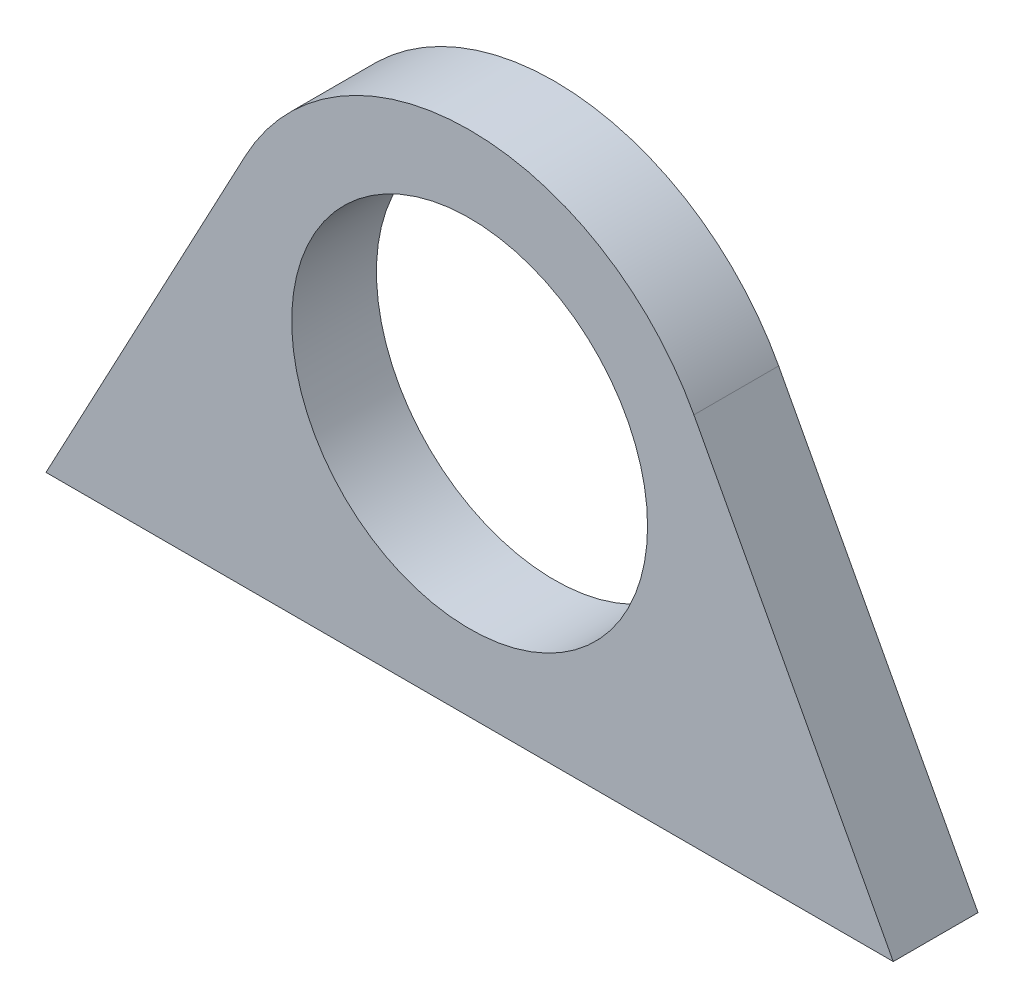
ISO-10303-21;
HEADER;
FILE_DESCRIPTION(('STEP AP214'),'2;1');
FILE_NAME('part.step','',(''),(''),'','','');
FILE_SCHEMA(('AUTOMOTIVE_DESIGN { 1 0 10303 214 1 1 1 1 }'));
ENDSEC;
DATA;
#1=APPLICATION_CONTEXT('core data for automotive mechanical design processes');
#2=APPLICATION_PROTOCOL_DEFINITION('international standard','automotive_design',2000,#1);
#3=PRODUCT_CONTEXT('',#1,'mechanical');
#4=PRODUCT('Part','Part','',(#3));
#5=PRODUCT_RELATED_PRODUCT_CATEGORY('part','',(#4));
#6=PRODUCT_DEFINITION_FORMATION('','',#4);
#7=PRODUCT_DEFINITION_CONTEXT('part definition',#1,'design');
#8=PRODUCT_DEFINITION('design','',#6,#7);
#9=PRODUCT_DEFINITION_SHAPE('','',#8);
#10=(LENGTH_UNIT() NAMED_UNIT(*) SI_UNIT(.MILLI.,.METRE.));
#11=(NAMED_UNIT(*) PLANE_ANGLE_UNIT() SI_UNIT($,.RADIAN.));
#12=(NAMED_UNIT(*) SI_UNIT($,.STERADIAN.) SOLID_ANGLE_UNIT());
#13=UNCERTAINTY_MEASURE_WITH_UNIT(LENGTH_MEASURE(1.E-05),#10,'distance_accuracy_value','');
#14=(GEOMETRIC_REPRESENTATION_CONTEXT(3) GLOBAL_UNCERTAINTY_ASSIGNED_CONTEXT((#13)) GLOBAL_UNIT_ASSIGNED_CONTEXT((#10,
#11,#12)) REPRESENTATION_CONTEXT('',''));
#15=CARTESIAN_POINT('',(0.,0.,0.));
#16=DIRECTION('',(0.,0.,1.));
#17=DIRECTION('',(1.,0.,0.));
#18=AXIS2_PLACEMENT_3D('',#15,#16,#17);
#19=CARTESIAN_POINT('',(0.,0.,5.));
#20=DIRECTION('',(0.,0.,1.));
#21=DIRECTION('',(1.,0.,0.));
#22=AXIS2_PLACEMENT_3D('',#19,#20,#21);
#23=PLANE('',#22);
#24=DIRECTION('',(-0.470588235294118,0.882352941176471,0.));
#25=VECTOR('',#24,1.);
#26=CARTESIAN_POINT('',(25.,-15.,5.));
#27=LINE('',#26,#25);
#28=CARTESIAN_POINT('',(25.,-15.,5.));
#29=VERTEX_POINT('',#28);
#30=CARTESIAN_POINT('',(13.2352941176471,7.05882352941177,5.));
#31=VERTEX_POINT('',#30);
#32=EDGE_CURVE('E92',#29,#31,#27,.T.);
#33=ORIENTED_EDGE('',*,*,#32,.T.);
#34=CARTESIAN_POINT('',(0.,0.,5.));
#35=DIRECTION('',(0.,0.,1.));
#36=DIRECTION('',(1.,0.,0.));
#37=AXIS2_PLACEMENT_3D('',#34,#35,#36);
#38=CIRCLE('',#37,15.);
#39=CARTESIAN_POINT('',(-13.2352941176471,7.05882352941177,5.));
#40=VERTEX_POINT('',#39);
#41=EDGE_CURVE('E87',#31,#40,#38,.T.);
#42=ORIENTED_EDGE('',*,*,#41,.T.);
#43=DIRECTION('',(-0.470588235294118,-0.882352941176471,0.));
#44=VECTOR('',#43,1.);
#45=CARTESIAN_POINT('',(-25.,-15.,5.));
#46=LINE('',#45,#44);
#47=CARTESIAN_POINT('',(-25.,-15.,5.));
#48=VERTEX_POINT('',#47);
#49=EDGE_CURVE('E90',#40,#48,#46,.T.);
#50=ORIENTED_EDGE('',*,*,#49,.T.);
#51=DIRECTION('',(1.,0.,0.));
#52=VECTOR('',#51,1.);
#53=CARTESIAN_POINT('',(-25.,-15.,5.));
#54=LINE('',#53,#52);
#55=EDGE_CURVE('E57',#48,#29,#54,.T.);
#56=ORIENTED_EDGE('',*,*,#55,.T.);
#57=EDGE_LOOP('',(#33,#42,#50,#56));
#58=FACE_BOUND('',#57,.T.);
#59=CARTESIAN_POINT('',(0.,0.,5.));
#60=DIRECTION('',(0.,0.,1.));
#61=DIRECTION('',(1.,0.,0.));
#62=AXIS2_PLACEMENT_3D('',#59,#60,#61);
#63=CIRCLE('',#62,10.5);
#64=CARTESIAN_POINT('',(10.5,0.,5.));
#65=VERTEX_POINT('',#64);
#66=EDGE_CURVE('E112',#65,#65,#63,.T.);
#67=ORIENTED_EDGE('',*,*,#66,.F.);
#68=EDGE_LOOP('',(#67));
#69=FACE_BOUND('',#68,.T.);
#70=ADVANCED_FACE('F39',(#58,#69),#23,.T.);
#71=CARTESIAN_POINT('',(0.,0.,0.));
#72=DIRECTION('',(0.,0.,1.));
#73=DIRECTION('',(1.,0.,0.));
#74=AXIS2_PLACEMENT_3D('',#71,#72,#73);
#75=PLANE('',#74);
#76=DIRECTION('',(-0.470588235294118,0.882352941176471,0.));
#77=VECTOR('',#76,1.);
#78=CARTESIAN_POINT('',(25.,-15.,0.));
#79=LINE('',#78,#77);
#80=CARTESIAN_POINT('',(25.,-15.,0.));
#81=VERTEX_POINT('',#80);
#82=CARTESIAN_POINT('',(13.2352941176471,7.05882352941177,0.));
#83=VERTEX_POINT('',#82);
#84=EDGE_CURVE('E108',#81,#83,#79,.T.);
#85=ORIENTED_EDGE('',*,*,#84,.F.);
#86=DIRECTION('',(1.,0.,0.));
#87=VECTOR('',#86,1.);
#88=CARTESIAN_POINT('',(-25.,-15.,0.));
#89=LINE('',#88,#87);
#90=CARTESIAN_POINT('',(-25.,-15.,0.));
#91=VERTEX_POINT('',#90);
#92=EDGE_CURVE('E80',#91,#81,#89,.T.);
#93=ORIENTED_EDGE('',*,*,#92,.F.);
#94=DIRECTION('',(-0.470588235294118,-0.882352941176471,0.));
#95=VECTOR('',#94,1.);
#96=CARTESIAN_POINT('',(-25.,-15.,0.));
#97=LINE('',#96,#95);
#98=CARTESIAN_POINT('',(-13.2352941176471,7.05882352941177,0.));
#99=VERTEX_POINT('',#98);
#100=EDGE_CURVE('E74',#99,#91,#97,.T.);
#101=ORIENTED_EDGE('',*,*,#100,.F.);
#102=CARTESIAN_POINT('',(0.,0.,0.));
#103=DIRECTION('',(0.,0.,1.));
#104=DIRECTION('',(1.,0.,0.));
#105=AXIS2_PLACEMENT_3D('',#102,#103,#104);
#106=CIRCLE('',#105,15.);
#107=EDGE_CURVE('E97',#83,#99,#106,.T.);
#108=ORIENTED_EDGE('',*,*,#107,.F.);
#109=EDGE_LOOP('',(#85,#93,#101,#108));
#110=FACE_BOUND('',#109,.T.);
#111=CARTESIAN_POINT('',(0.,0.,0.));
#112=DIRECTION('',(0.,0.,1.));
#113=DIRECTION('',(1.,0.,0.));
#114=AXIS2_PLACEMENT_3D('',#111,#112,#113);
#115=CIRCLE('',#114,10.5);
#116=CARTESIAN_POINT('',(10.5,0.,0.));
#117=VERTEX_POINT('',#116);
#118=EDGE_CURVE('E130',#117,#117,#115,.T.);
#119=ORIENTED_EDGE('',*,*,#118,.T.);
#120=EDGE_LOOP('',(#119));
#121=FACE_BOUND('',#120,.T.);
#122=ADVANCED_FACE('F125',(#110,#121),#75,.F.);
#123=CARTESIAN_POINT('',(25.,-15.,5.));
#124=DIRECTION('',(-0.882352941176471,-0.470588235294118,0.));
#125=DIRECTION('',(0.470588235294118,-0.882352941176471,0.));
#126=AXIS2_PLACEMENT_3D('',#123,#124,#125);
#127=PLANE('',#126);
#128=ORIENTED_EDGE('',*,*,#84,.T.);
#129=DIRECTION('',(0.,0.,-1.));
#130=VECTOR('',#129,1.);
#131=CARTESIAN_POINT('',(13.2352941176471,7.05882352941177,5.));
#132=LINE('',#131,#130);
#133=EDGE_CURVE('E11',#31,#83,#132,.T.);
#134=ORIENTED_EDGE('',*,*,#133,.F.);
#135=ORIENTED_EDGE('',*,*,#32,.F.);
#136=DIRECTION('',(0.,0.,-1.));
#137=VECTOR('',#136,1.);
#138=CARTESIAN_POINT('',(25.,-15.,5.));
#139=LINE('',#138,#137);
#140=EDGE_CURVE('E104',#29,#81,#139,.T.);
#141=ORIENTED_EDGE('',*,*,#140,.T.);
#142=EDGE_LOOP('',(#128,#134,#135,#141));
#143=FACE_BOUND('',#142,.T.);
#144=ADVANCED_FACE('F41',(#143),#127,.F.);
#145=CARTESIAN_POINT('',(0.,0.,5.));
#146=DIRECTION('',(0.,0.,-1.));
#147=DIRECTION('',(-1.,0.,0.));
#148=AXIS2_PLACEMENT_3D('',#145,#146,#147);
#149=CYLINDRICAL_SURFACE('',#148,15.);
#150=ORIENTED_EDGE('',*,*,#107,.T.);
#151=DIRECTION('',(0.,0.,-1.));
#152=VECTOR('',#151,1.);
#153=CARTESIAN_POINT('',(-13.2352941176471,7.05882352941177,5.));
#154=LINE('',#153,#152);
#155=EDGE_CURVE('E49',#40,#99,#154,.T.);
#156=ORIENTED_EDGE('',*,*,#155,.F.);
#157=ORIENTED_EDGE('',*,*,#41,.F.);
#158=ORIENTED_EDGE('',*,*,#133,.T.);
#159=EDGE_LOOP('',(#150,#156,#157,#158));
#160=FACE_BOUND('',#159,.T.);
#161=ADVANCED_FACE('F96',(#160),#149,.T.);
#162=CARTESIAN_POINT('',(-25.,-15.,5.));
#163=DIRECTION('',(0.882352941176471,-0.470588235294118,0.));
#164=DIRECTION('',(0.470588235294118,0.882352941176471,0.));
#165=AXIS2_PLACEMENT_3D('',#162,#163,#164);
#166=PLANE('',#165);
#167=ORIENTED_EDGE('',*,*,#100,.T.);
#168=DIRECTION('',(0.,0.,-1.));
#169=VECTOR('',#168,1.);
#170=CARTESIAN_POINT('',(-25.,-15.,5.));
#171=LINE('',#170,#169);
#172=EDGE_CURVE('E99',#48,#91,#171,.T.);
#173=ORIENTED_EDGE('',*,*,#172,.F.);
#174=ORIENTED_EDGE('',*,*,#49,.F.);
#175=ORIENTED_EDGE('',*,*,#155,.T.);
#176=EDGE_LOOP('',(#167,#173,#174,#175));
#177=FACE_BOUND('',#176,.T.);
#178=ADVANCED_FACE('F100',(#177),#166,.F.);
#179=CARTESIAN_POINT('',(-25.,-15.,5.));
#180=DIRECTION('',(0.,1.,0.));
#181=DIRECTION('',(-1.,0.,0.));
#182=AXIS2_PLACEMENT_3D('',#179,#180,#181);
#183=PLANE('',#182);
#184=ORIENTED_EDGE('',*,*,#92,.T.);
#185=ORIENTED_EDGE('',*,*,#140,.F.);
#186=ORIENTED_EDGE('',*,*,#55,.F.);
#187=ORIENTED_EDGE('',*,*,#172,.T.);
#188=EDGE_LOOP('',(#184,#185,#186,#187));
#189=FACE_BOUND('',#188,.T.);
#190=ADVANCED_FACE('F122',(#189),#183,.F.);
#191=CARTESIAN_POINT('',(0.,0.,5.));
#192=DIRECTION('',(0.,0.,-1.));
#193=DIRECTION('',(-1.,0.,0.));
#194=AXIS2_PLACEMENT_3D('',#191,#192,#193);
#195=CYLINDRICAL_SURFACE('',#194,10.5);
#196=ORIENTED_EDGE('',*,*,#66,.T.);
#197=EDGE_LOOP('',(#196));
#198=FACE_BOUND('',#197,.T.);
#199=ORIENTED_EDGE('',*,*,#118,.F.);
#200=EDGE_LOOP('',(#199));
#201=FACE_BOUND('',#200,.T.);
#202=ADVANCED_FACE('F138',(#198,#201),#195,.F.);
#203=CLOSED_SHELL('',(#70,#122,#144,#161,#178,#190,#202));
#204=MANIFOLD_SOLID_BREP('B2',#203);
#205=ADVANCED_BREP_SHAPE_REPRESENTATION('',(#18,#204),#14);
#206=SHAPE_DEFINITION_REPRESENTATION(#9,#205);
ENDSEC;
END-ISO-10303-21;
